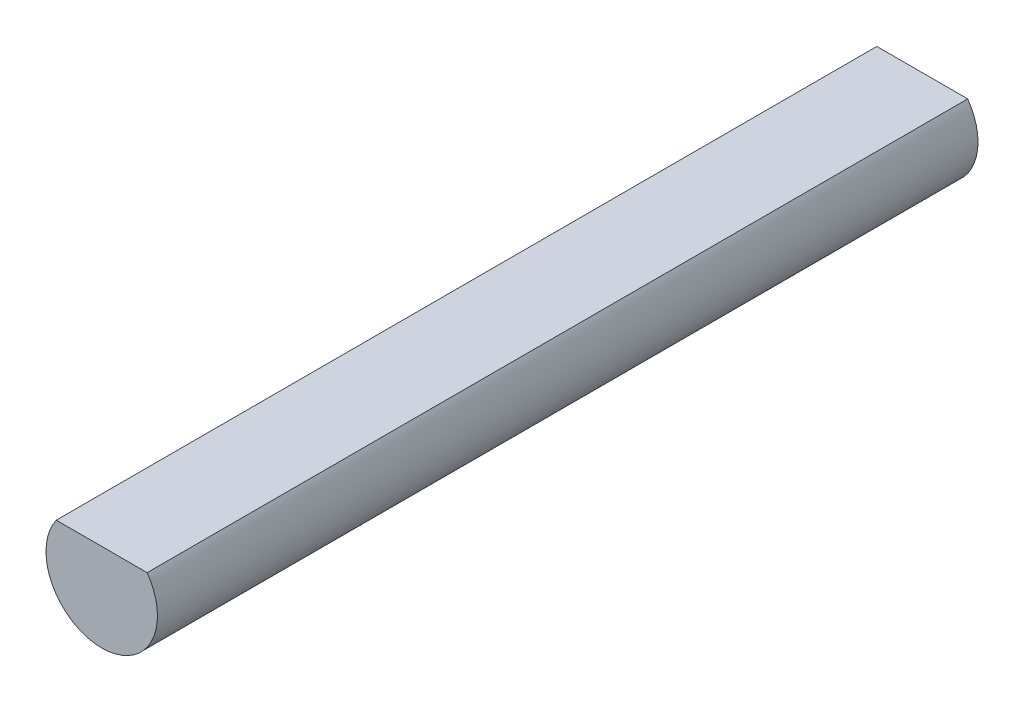
ISO-10303-21;
HEADER;
FILE_DESCRIPTION(('STEP AP214'),'2;1');
FILE_NAME('part.step','',(''),(''),'','','');
FILE_SCHEMA(('AUTOMOTIVE_DESIGN { 1 0 10303 214 1 1 1 1 }'));
ENDSEC;
DATA;
#1=APPLICATION_CONTEXT('core data for automotive mechanical design processes');
#2=APPLICATION_PROTOCOL_DEFINITION('international standard','automotive_design',2000,#1);
#3=PRODUCT_CONTEXT('',#1,'mechanical');
#4=PRODUCT('Part','Part','',(#3));
#5=PRODUCT_RELATED_PRODUCT_CATEGORY('part','',(#4));
#6=PRODUCT_DEFINITION_FORMATION('','',#4);
#7=PRODUCT_DEFINITION_CONTEXT('part definition',#1,'design');
#8=PRODUCT_DEFINITION('design','',#6,#7);
#9=PRODUCT_DEFINITION_SHAPE('','',#8);
#10=(LENGTH_UNIT() NAMED_UNIT(*) SI_UNIT(.MILLI.,.METRE.));
#11=(NAMED_UNIT(*) PLANE_ANGLE_UNIT() SI_UNIT($,.RADIAN.));
#12=(NAMED_UNIT(*) SI_UNIT($,.STERADIAN.) SOLID_ANGLE_UNIT());
#13=UNCERTAINTY_MEASURE_WITH_UNIT(LENGTH_MEASURE(1.E-05),#10,'distance_accuracy_value','');
#14=(GEOMETRIC_REPRESENTATION_CONTEXT(3) GLOBAL_UNCERTAINTY_ASSIGNED_CONTEXT((#13)) GLOBAL_UNIT_ASSIGNED_CONTEXT((#10,
#11,#12)) REPRESENTATION_CONTEXT('',''));
#15=CARTESIAN_POINT('',(0.,0.,0.));
#16=DIRECTION('',(0.,0.,1.));
#17=DIRECTION('',(1.,0.,0.));
#18=AXIS2_PLACEMENT_3D('',#15,#16,#17);
#19=CARTESIAN_POINT('',(0.,0.,-46.1899));
#20=DIRECTION('',(0.,0.,1.));
#21=DIRECTION('',(1.,0.,0.));
#22=AXIS2_PLACEMENT_3D('',#19,#20,#21);
#23=CYLINDRICAL_SURFACE('',#22,3.1369);
#24=DIRECTION('',(0.,0.,1.));
#25=VECTOR('',#24,1.);
#26=CARTESIAN_POINT('',(2.55771820183538,1.8161,-46.1899));
#27=LINE('',#26,#25);
#28=CARTESIAN_POINT('',(2.55771820183538,1.8161,-46.1899));
#29=VERTEX_POINT('',#28);
#30=CARTESIAN_POINT('',(2.55771820183538,1.8161,0.));
#31=VERTEX_POINT('',#30);
#32=EDGE_CURVE('E66',#29,#31,#27,.T.);
#33=ORIENTED_EDGE('',*,*,#32,.T.);
#34=CARTESIAN_POINT('',(0.,0.,0.));
#35=DIRECTION('',(0.,0.,1.));
#36=DIRECTION('',(1.,0.,0.));
#37=AXIS2_PLACEMENT_3D('',#34,#35,#36);
#38=CIRCLE('',#37,3.1369);
#39=CARTESIAN_POINT('',(-2.55771820183538,1.8161,0.));
#40=VERTEX_POINT('',#39);
#41=EDGE_CURVE('E42',#40,#31,#38,.T.);
#42=ORIENTED_EDGE('',*,*,#41,.F.);
#43=DIRECTION('',(0.,0.,1.));
#44=VECTOR('',#43,1.);
#45=CARTESIAN_POINT('',(-2.55771820183538,1.8161,-46.1899));
#46=LINE('',#45,#44);
#47=CARTESIAN_POINT('',(-2.55771820183538,1.8161,-46.1899));
#48=VERTEX_POINT('',#47);
#49=EDGE_CURVE('E54',#48,#40,#46,.T.);
#50=ORIENTED_EDGE('',*,*,#49,.F.);
#51=CARTESIAN_POINT('',(0.,0.,-46.1899));
#52=DIRECTION('',(0.,0.,1.));
#53=DIRECTION('',(1.,0.,0.));
#54=AXIS2_PLACEMENT_3D('',#51,#52,#53);
#55=CIRCLE('',#54,3.1369);
#56=EDGE_CURVE('E11',#48,#29,#55,.T.);
#57=ORIENTED_EDGE('',*,*,#56,.T.);
#58=EDGE_LOOP('',(#33,#42,#50,#57));
#59=FACE_BOUND('',#58,.T.);
#60=ADVANCED_FACE('F39',(#59),#23,.T.);
#61=CARTESIAN_POINT('',(0.,0.,-46.1899));
#62=DIRECTION('',(0.,0.,1.));
#63=DIRECTION('',(1.,0.,0.));
#64=AXIS2_PLACEMENT_3D('',#61,#62,#63);
#65=PLANE('',#64);
#66=ORIENTED_EDGE('',*,*,#56,.F.);
#67=DIRECTION('',(1.,0.,0.));
#68=VECTOR('',#67,1.);
#69=CARTESIAN_POINT('',(-2.55771820183538,1.8161,-46.1899));
#70=LINE('',#69,#68);
#71=EDGE_CURVE('E60',#48,#29,#70,.T.);
#72=ORIENTED_EDGE('',*,*,#71,.T.);
#73=EDGE_LOOP('',(#66,#72));
#74=FACE_BOUND('',#73,.T.);
#75=ADVANCED_FACE('F83',(#74),#65,.F.);
#76=CARTESIAN_POINT('',(0.,0.,0.));
#77=DIRECTION('',(0.,0.,1.));
#78=DIRECTION('',(1.,0.,0.));
#79=AXIS2_PLACEMENT_3D('',#76,#77,#78);
#80=PLANE('',#79);
#81=DIRECTION('',(1.,0.,0.));
#82=VECTOR('',#81,1.);
#83=CARTESIAN_POINT('',(-2.55771820183538,1.8161,0.));
#84=LINE('',#83,#82);
#85=EDGE_CURVE('E63',#40,#31,#84,.T.);
#86=ORIENTED_EDGE('',*,*,#85,.F.);
#87=ORIENTED_EDGE('',*,*,#41,.T.);
#88=EDGE_LOOP('',(#86,#87));
#89=FACE_BOUND('',#88,.T.);
#90=ADVANCED_FACE('F76',(#89),#80,.T.);
#91=CARTESIAN_POINT('',(-2.55771820183538,1.8161,-46.1899));
#92=DIRECTION('',(0.,-1.,0.));
#93=DIRECTION('',(0.,0.,-1.));
#94=AXIS2_PLACEMENT_3D('',#91,#92,#93);
#95=PLANE('',#94);
#96=ORIENTED_EDGE('',*,*,#85,.T.);
#97=ORIENTED_EDGE('',*,*,#32,.F.);
#98=ORIENTED_EDGE('',*,*,#71,.F.);
#99=ORIENTED_EDGE('',*,*,#49,.T.);
#100=EDGE_LOOP('',(#96,#97,#98,#99));
#101=FACE_BOUND('',#100,.T.);
#102=ADVANCED_FACE('F65',(#101),#95,.F.);
#103=CLOSED_SHELL('',(#60,#75,#90,#102));
#104=MANIFOLD_SOLID_BREP('B2',#103);
#105=ADVANCED_BREP_SHAPE_REPRESENTATION('',(#18,#104),#14);
#106=SHAPE_DEFINITION_REPRESENTATION(#9,#105);
ENDSEC;
END-ISO-10303-21;
